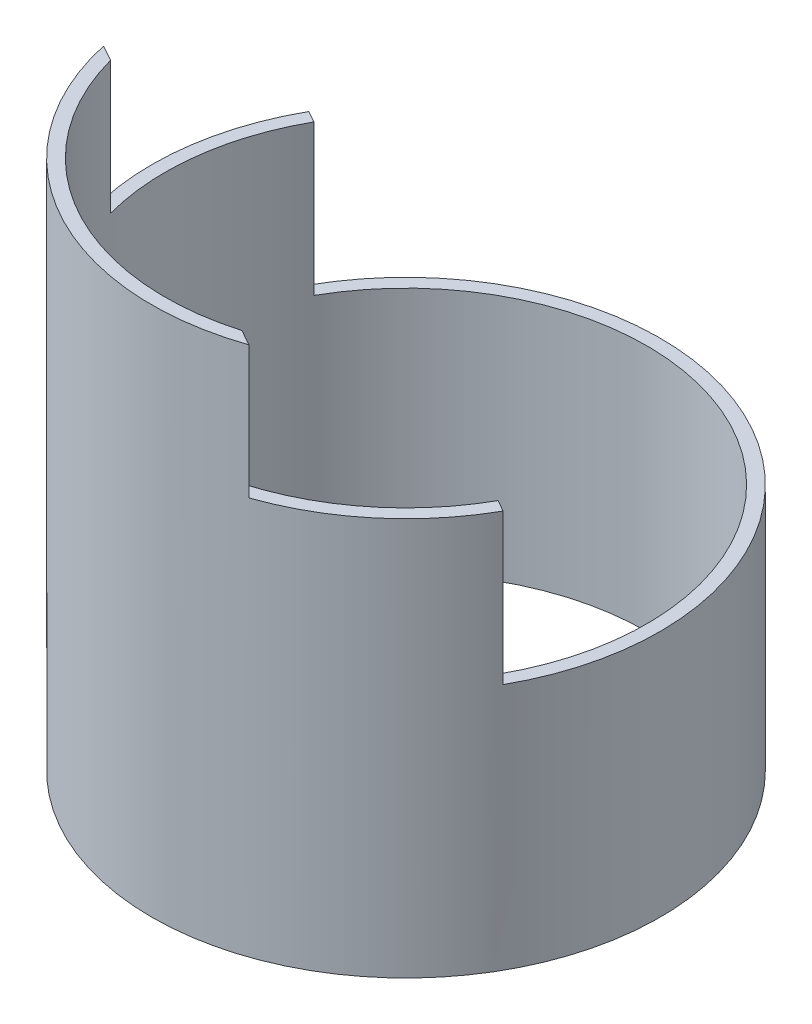
ISO-10303-21;
HEADER;
FILE_DESCRIPTION(('STEP AP214'),'2;1');
FILE_NAME('part.step','',(''),(''),'','','');
FILE_SCHEMA(('AUTOMOTIVE_DESIGN { 1 0 10303 214 1 1 1 1 }'));
ENDSEC;
DATA;
#1=APPLICATION_CONTEXT('core data for automotive mechanical design processes');
#2=APPLICATION_PROTOCOL_DEFINITION('international standard','automotive_design',2000,#1);
#3=PRODUCT_CONTEXT('',#1,'mechanical');
#4=PRODUCT('Part','Part','',(#3));
#5=PRODUCT_RELATED_PRODUCT_CATEGORY('part','',(#4));
#6=PRODUCT_DEFINITION_FORMATION('','',#4);
#7=PRODUCT_DEFINITION_CONTEXT('part definition',#1,'design');
#8=PRODUCT_DEFINITION('design','',#6,#7);
#9=PRODUCT_DEFINITION_SHAPE('','',#8);
#10=(LENGTH_UNIT() NAMED_UNIT(*) SI_UNIT(.MILLI.,.METRE.));
#11=(NAMED_UNIT(*) PLANE_ANGLE_UNIT() SI_UNIT($,.RADIAN.));
#12=(NAMED_UNIT(*) SI_UNIT($,.STERADIAN.) SOLID_ANGLE_UNIT());
#13=UNCERTAINTY_MEASURE_WITH_UNIT(LENGTH_MEASURE(1.E-05),#10,'distance_accuracy_value','');
#14=(GEOMETRIC_REPRESENTATION_CONTEXT(3) GLOBAL_UNCERTAINTY_ASSIGNED_CONTEXT((#13)) GLOBAL_UNIT_ASSIGNED_CONTEXT((#10,
#11,#12)) REPRESENTATION_CONTEXT('',''));
#15=CARTESIAN_POINT('',(0.,0.,0.));
#16=DIRECTION('',(0.,0.,1.));
#17=DIRECTION('',(1.,0.,0.));
#18=AXIS2_PLACEMENT_3D('',#15,#16,#17);
#19=CARTESIAN_POINT('',(0.,120.,0.));
#20=DIRECTION('',(0.,1.,0.));
#21=DIRECTION('',(0.,0.,1.));
#22=AXIS2_PLACEMENT_3D('',#19,#20,#21);
#23=PLANE('',#22);
#24=CARTESIAN_POINT('',(0.,120.,0.));
#25=DIRECTION('',(0.,1.,0.));
#26=DIRECTION('',(0.,0.,1.));
#27=AXIS2_PLACEMENT_3D('',#24,#25,#26);
#28=CIRCLE('',#27,57.5);
#29=CARTESIAN_POINT('',(-56.1853927620716,120.,12.2250415202414));
#30=VERTEX_POINT('',#29);
#31=CARTESIAN_POINT('',(18.7962011164049,120.,54.3410786016576));
#32=VERTEX_POINT('',#31);
#33=EDGE_CURVE('E142',#30,#32,#28,.T.);
#34=ORIENTED_EDGE('',*,*,#33,.T.);
#35=DIRECTION('',(-0.871878998586936,0.,-0.489721361411816));
#36=VECTOR('',#35,1.);
#37=CARTESIAN_POINT('',(-56.1853927620716,120.,12.2250415202414));
#38=LINE('',#37,#36);
#39=CARTESIAN_POINT('',(15.2191437396484,120.,52.3318991040066));
#40=VERTEX_POINT('',#39);
#41=EDGE_CURVE('E106',#32,#40,#38,.T.);
#42=ORIENTED_EDGE('',*,*,#41,.T.);
#43=CARTESIAN_POINT('',(0.,120.,0.));
#44=DIRECTION('',(0.,1.,0.));
#45=DIRECTION('',(0.,0.,1.));
#46=AXIS2_PLACEMENT_3D('',#43,#44,#45);
#47=CIRCLE('',#46,54.5);
#48=CARTESIAN_POINT('',(-52.608335385315,120.,14.2342210178925));
#49=VERTEX_POINT('',#48);
#50=EDGE_CURVE('E143',#49,#40,#47,.T.);
#51=ORIENTED_EDGE('',*,*,#50,.F.);
#52=EDGE_CURVE('E137',#49,#30,#38,.T.);
#53=ORIENTED_EDGE('',*,*,#52,.T.);
#54=EDGE_LOOP('',(#34,#42,#51,#53));
#55=FACE_BOUND('',#54,.T.);
#56=ADVANCED_FACE('F35',(#55),#23,.T.);
#57=CARTESIAN_POINT('',(0.,120.,0.));
#58=DIRECTION('',(0.,-1.,0.));
#59=DIRECTION('',(0.,0.,-1.));
#60=AXIS2_PLACEMENT_3D('',#57,#58,#59);
#61=CYLINDRICAL_SURFACE('',#60,57.5);
#62=DIRECTION('',(0.,1.,0.));
#63=VECTOR('',#62,1.);
#64=CARTESIAN_POINT('',(18.7962011164049,90.,54.3410786016576));
#65=LINE('',#64,#63);
#66=CARTESIAN_POINT('',(18.7962011164049,90.,54.3410786016576));
#67=VERTEX_POINT('',#66);
#68=EDGE_CURVE('E102',#67,#32,#65,.T.);
#69=ORIENTED_EDGE('',*,*,#68,.T.);
#70=ORIENTED_EDGE('',*,*,#33,.F.);
#71=DIRECTION('',(0.,1.,0.));
#72=VECTOR('',#71,1.);
#73=CARTESIAN_POINT('',(-56.1853927620716,90.,12.2250415202414));
#74=LINE('',#73,#72);
#75=CARTESIAN_POINT('',(-56.1853927620716,90.,12.2250415202414));
#76=VERTEX_POINT('',#75);
#77=EDGE_CURVE('E110',#76,#30,#74,.T.);
#78=ORIENTED_EDGE('',*,*,#77,.F.);
#79=CARTESIAN_POINT('',(0.,90.,0.));
#80=DIRECTION('',(0.,1.,0.));
#81=DIRECTION('',(0.,0.,1.));
#82=AXIS2_PLACEMENT_3D('',#79,#80,#81);
#83=CIRCLE('',#82,57.5);
#84=CARTESIAN_POINT('',(-50.1330424187487,90.,-28.1589782811795));
#85=VERTEX_POINT('',#84);
#86=EDGE_CURVE('E123',#85,#76,#83,.T.);
#87=ORIENTED_EDGE('',*,*,#86,.F.);
#88=DIRECTION('',(0.,1.,0.));
#89=VECTOR('',#88,1.);
#90=CARTESIAN_POINT('',(-50.1330424187487,56.,-28.1589782811795));
#91=LINE('',#90,#89);
#92=CARTESIAN_POINT('',(-50.1330424187487,56.,-28.1589782811795));
#93=VERTEX_POINT('',#92);
#94=EDGE_CURVE('E200',#93,#85,#91,.T.);
#95=ORIENTED_EDGE('',*,*,#94,.F.);
#96=CARTESIAN_POINT('',(0.,56.,0.));
#97=DIRECTION('',(0.,1.,0.));
#98=DIRECTION('',(0.,0.,1.));
#99=AXIS2_PLACEMENT_3D('',#96,#97,#98);
#100=CIRCLE('',#99,57.5);
#101=CARTESIAN_POINT('',(50.1330424187473,56.,28.1589782811784));
#102=VERTEX_POINT('',#101);
#103=EDGE_CURVE('E199',#102,#93,#100,.T.);
#104=ORIENTED_EDGE('',*,*,#103,.F.);
#105=DIRECTION('',(0.,1.,0.));
#106=VECTOR('',#105,1.);
#107=CARTESIAN_POINT('',(50.1330424187473,56.,28.1589782811784));
#108=LINE('',#107,#106);
#109=CARTESIAN_POINT('',(50.1330424187473,90.,28.1589782811784));
#110=VERTEX_POINT('',#109);
#111=EDGE_CURVE('E120',#102,#110,#108,.T.);
#112=ORIENTED_EDGE('',*,*,#111,.T.);
#113=EDGE_CURVE('E50',#67,#110,#83,.T.);
#114=ORIENTED_EDGE('',*,*,#113,.F.);
#115=EDGE_LOOP('',(#69,#70,#78,#87,#95,#104,#112,#114));
#116=FACE_BOUND('',#115,.T.);
#117=CARTESIAN_POINT('',(0.,0.,0.));
#118=DIRECTION('',(0.,1.,0.));
#119=DIRECTION('',(0.,0.,1.));
#120=AXIS2_PLACEMENT_3D('',#117,#118,#119);
#121=CIRCLE('',#120,57.5);
#122=CARTESIAN_POINT('',(0.,0.,57.5));
#123=VERTEX_POINT('',#122);
#124=EDGE_CURVE('E147',#123,#123,#121,.T.);
#125=ORIENTED_EDGE('',*,*,#124,.T.);
#126=EDGE_LOOP('',(#125));
#127=FACE_BOUND('',#126,.T.);
#128=ADVANCED_FACE('F37',(#116,#127),#61,.T.);
#129=CARTESIAN_POINT('',(0.,120.,0.));
#130=DIRECTION('',(0.,-1.,0.));
#131=DIRECTION('',(0.,0.,-1.));
#132=AXIS2_PLACEMENT_3D('',#129,#130,#131);
#133=CYLINDRICAL_SURFACE('',#132,54.5);
#134=CARTESIAN_POINT('',(0.,0.,0.));
#135=DIRECTION('',(0.,1.,0.));
#136=DIRECTION('',(0.,0.,1.));
#137=AXIS2_PLACEMENT_3D('',#134,#135,#136);
#138=CIRCLE('',#137,54.5);
#139=CARTESIAN_POINT('',(0.,0.,54.5));
#140=VERTEX_POINT('',#139);
#141=EDGE_CURVE('E154',#140,#140,#138,.T.);
#142=ORIENTED_EDGE('',*,*,#141,.F.);
#143=EDGE_LOOP('',(#142));
#144=FACE_BOUND('',#143,.T.);
#145=DIRECTION('',(0.,-1.,0.));
#146=VECTOR('',#145,1.);
#147=CARTESIAN_POINT('',(15.2191437396484,120.,52.3318991040066));
#148=LINE('',#147,#146);
#149=CARTESIAN_POINT('',(15.2191437396484,90.,52.3318991040066));
#150=VERTEX_POINT('',#149);
#151=EDGE_CURVE('E12',#40,#150,#148,.T.);
#152=ORIENTED_EDGE('',*,*,#151,.T.);
#153=CARTESIAN_POINT('',(0.,90.,0.));
#154=DIRECTION('',(0.,1.,0.));
#155=DIRECTION('',(0.,0.,1.));
#156=AXIS2_PLACEMENT_3D('',#153,#154,#155);
#157=CIRCLE('',#156,54.5);
#158=CARTESIAN_POINT('',(47.5174054229881,90.,26.6898141969438));
#159=VERTEX_POINT('',#158);
#160=EDGE_CURVE('E114',#150,#159,#157,.T.);
#161=ORIENTED_EDGE('',*,*,#160,.T.);
#162=DIRECTION('',(0.,-1.,0.));
#163=VECTOR('',#162,1.);
#164=CARTESIAN_POINT('',(47.5174054229881,120.,26.6898141969438));
#165=LINE('',#164,#163);
#166=CARTESIAN_POINT('',(47.5174054229881,56.,26.6898141969438));
#167=VERTEX_POINT('',#166);
#168=EDGE_CURVE('E159',#159,#167,#165,.T.);
#169=ORIENTED_EDGE('',*,*,#168,.T.);
#170=CARTESIAN_POINT('',(0.,56.,0.));
#171=DIRECTION('',(0.,1.,0.));
#172=DIRECTION('',(0.,0.,1.));
#173=AXIS2_PLACEMENT_3D('',#170,#171,#172);
#174=CIRCLE('',#173,54.5);
#175=CARTESIAN_POINT('',(-47.5174054229879,56.,-26.6898141969441));
#176=VERTEX_POINT('',#175);
#177=EDGE_CURVE('E149',#167,#176,#174,.T.);
#178=ORIENTED_EDGE('',*,*,#177,.T.);
#179=DIRECTION('',(0.,-1.,0.));
#180=VECTOR('',#179,1.);
#181=CARTESIAN_POINT('',(-47.5174054229879,120.,-26.6898141969441));
#182=LINE('',#181,#180);
#183=CARTESIAN_POINT('',(-47.5174054229879,90.,-26.6898141969441));
#184=VERTEX_POINT('',#183);
#185=EDGE_CURVE('E146',#176,#184,#182,.F.);
#186=ORIENTED_EDGE('',*,*,#185,.T.);
#187=CARTESIAN_POINT('',(-52.608335385315,90.,14.2342210178925));
#188=VERTEX_POINT('',#187);
#189=EDGE_CURVE('E58',#184,#188,#157,.T.);
#190=ORIENTED_EDGE('',*,*,#189,.T.);
#191=DIRECTION('',(0.,-1.,0.));
#192=VECTOR('',#191,1.);
#193=CARTESIAN_POINT('',(-52.608335385315,120.,14.2342210178925));
#194=LINE('',#193,#192);
#195=EDGE_CURVE('E43',#188,#49,#194,.F.);
#196=ORIENTED_EDGE('',*,*,#195,.T.);
#197=ORIENTED_EDGE('',*,*,#50,.T.);
#198=EDGE_LOOP('',(#152,#161,#169,#178,#186,#190,#196,#197));
#199=FACE_BOUND('',#198,.T.);
#200=ADVANCED_FACE('F162',(#144,#199),#133,.F.);
#201=CARTESIAN_POINT('',(-50.1330424187487,56.,-28.1589782811795));
#202=DIRECTION('',(0.489721361411816,0.,-0.871878998586936));
#203=DIRECTION('',(-0.871878998586936,0.,-0.489721361411816));
#204=AXIS2_PLACEMENT_3D('',#201,#202,#203);
#205=PLANE('',#204);
#206=ORIENTED_EDGE('',*,*,#168,.F.);
#207=DIRECTION('',(0.871878998586936,0.,0.489721361411816));
#208=VECTOR('',#207,1.);
#209=CARTESIAN_POINT('',(-50.1330424187487,90.,-28.1589782811795));
#210=LINE('',#209,#208);
#211=EDGE_CURVE('E127',#159,#110,#210,.T.);
#212=ORIENTED_EDGE('',*,*,#211,.T.);
#213=ORIENTED_EDGE('',*,*,#111,.F.);
#214=DIRECTION('',(-0.871878998586936,0.,-0.489721361411816));
#215=VECTOR('',#214,1.);
#216=CARTESIAN_POINT('',(-50.1330424187487,56.,-28.1589782811795));
#217=LINE('',#216,#215);
#218=EDGE_CURVE('E125',#102,#167,#217,.T.);
#219=ORIENTED_EDGE('',*,*,#218,.T.);
#220=EDGE_LOOP('',(#206,#212,#213,#219));
#221=FACE_BOUND('',#220,.T.);
#222=ADVANCED_FACE('F192',(#221),#205,.T.);
#223=ORIENTED_EDGE('',*,*,#94,.T.);
#224=DIRECTION('',(0.871878998586936,0.,0.489721361411816));
#225=VECTOR('',#224,1.);
#226=CARTESIAN_POINT('',(-50.1330424187487,90.,-28.1589782811795));
#227=LINE('',#226,#225);
#228=EDGE_CURVE('E161',#85,#184,#227,.T.);
#229=ORIENTED_EDGE('',*,*,#228,.T.);
#230=ORIENTED_EDGE('',*,*,#185,.F.);
#231=EDGE_CURVE('E121',#176,#93,#217,.T.);
#232=ORIENTED_EDGE('',*,*,#231,.T.);
#233=EDGE_LOOP('',(#223,#229,#230,#232));
#234=FACE_BOUND('',#233,.T.);
#235=ADVANCED_FACE('F186',(#234),#205,.T.);
#236=CARTESIAN_POINT('',(0.,0.,0.));
#237=DIRECTION('',(0.,1.,0.));
#238=DIRECTION('',(0.,0.,1.));
#239=AXIS2_PLACEMENT_3D('',#236,#237,#238);
#240=PLANE('',#239);
#241=ORIENTED_EDGE('',*,*,#124,.F.);
#242=EDGE_LOOP('',(#241));
#243=FACE_BOUND('',#242,.T.);
#244=ORIENTED_EDGE('',*,*,#141,.T.);
#245=EDGE_LOOP('',(#244));
#246=FACE_BOUND('',#245,.T.);
#247=ADVANCED_FACE('F173',(#243,#246),#240,.F.);
#248=CARTESIAN_POINT('',(0.,56.,0.));
#249=DIRECTION('',(0.,1.,0.));
#250=DIRECTION('',(0.,0.,1.));
#251=AXIS2_PLACEMENT_3D('',#248,#249,#250);
#252=PLANE('',#251);
#253=ORIENTED_EDGE('',*,*,#103,.T.);
#254=ORIENTED_EDGE('',*,*,#231,.F.);
#255=ORIENTED_EDGE('',*,*,#177,.F.);
#256=ORIENTED_EDGE('',*,*,#218,.F.);
#257=EDGE_LOOP('',(#253,#254,#255,#256));
#258=FACE_BOUND('',#257,.T.);
#259=ADVANCED_FACE('F166',(#258),#252,.T.);
#260=CARTESIAN_POINT('',(0.,90.,0.));
#261=DIRECTION('',(0.,1.,0.));
#262=DIRECTION('',(0.,0.,1.));
#263=AXIS2_PLACEMENT_3D('',#260,#261,#262);
#264=PLANE('',#263);
#265=ORIENTED_EDGE('',*,*,#86,.T.);
#266=DIRECTION('',(-0.871878998586936,0.,-0.489721361411816));
#267=VECTOR('',#266,1.);
#268=CARTESIAN_POINT('',(-56.1853927620716,90.,12.2250415202414));
#269=LINE('',#268,#267);
#270=EDGE_CURVE('E115',#188,#76,#269,.T.);
#271=ORIENTED_EDGE('',*,*,#270,.F.);
#272=ORIENTED_EDGE('',*,*,#189,.F.);
#273=ORIENTED_EDGE('',*,*,#228,.F.);
#274=EDGE_LOOP('',(#265,#271,#272,#273));
#275=FACE_BOUND('',#274,.T.);
#276=ADVANCED_FACE('F164',(#275),#264,.T.);
#277=CARTESIAN_POINT('',(-56.1853927620716,90.,12.2250415202414));
#278=DIRECTION('',(0.489721361411816,0.,-0.871878998586936));
#279=DIRECTION('',(-0.871878998586936,0.,-0.489721361411816));
#280=AXIS2_PLACEMENT_3D('',#277,#278,#279);
#281=PLANE('',#280);
#282=ORIENTED_EDGE('',*,*,#270,.T.);
#283=ORIENTED_EDGE('',*,*,#77,.T.);
#284=ORIENTED_EDGE('',*,*,#52,.F.);
#285=ORIENTED_EDGE('',*,*,#195,.F.);
#286=EDGE_LOOP('',(#282,#283,#284,#285));
#287=FACE_BOUND('',#286,.T.);
#288=ADVANCED_FACE('F163',(#287),#281,.T.);
#289=ORIENTED_EDGE('',*,*,#41,.F.);
#290=ORIENTED_EDGE('',*,*,#68,.F.);
#291=EDGE_CURVE('E104',#67,#150,#269,.T.);
#292=ORIENTED_EDGE('',*,*,#291,.T.);
#293=ORIENTED_EDGE('',*,*,#151,.F.);
#294=EDGE_LOOP('',(#289,#290,#292,#293));
#295=FACE_BOUND('',#294,.T.);
#296=ADVANCED_FACE('F103',(#295),#281,.T.);
#297=ORIENTED_EDGE('',*,*,#113,.T.);
#298=ORIENTED_EDGE('',*,*,#211,.F.);
#299=ORIENTED_EDGE('',*,*,#160,.F.);
#300=ORIENTED_EDGE('',*,*,#291,.F.);
#301=EDGE_LOOP('',(#297,#298,#299,#300));
#302=FACE_BOUND('',#301,.T.);
#303=ADVANCED_FACE('F112',(#302),#264,.T.);
#304=CLOSED_SHELL('',(#56,#128,#200,#222,#235,#247,#259,#276,#288,#296,#303));
#305=MANIFOLD_SOLID_BREP('B2',#304);
#306=ADVANCED_BREP_SHAPE_REPRESENTATION('',(#18,#305),#14);
#307=SHAPE_DEFINITION_REPRESENTATION(#9,#306);
ENDSEC;
END-ISO-10303-21;
